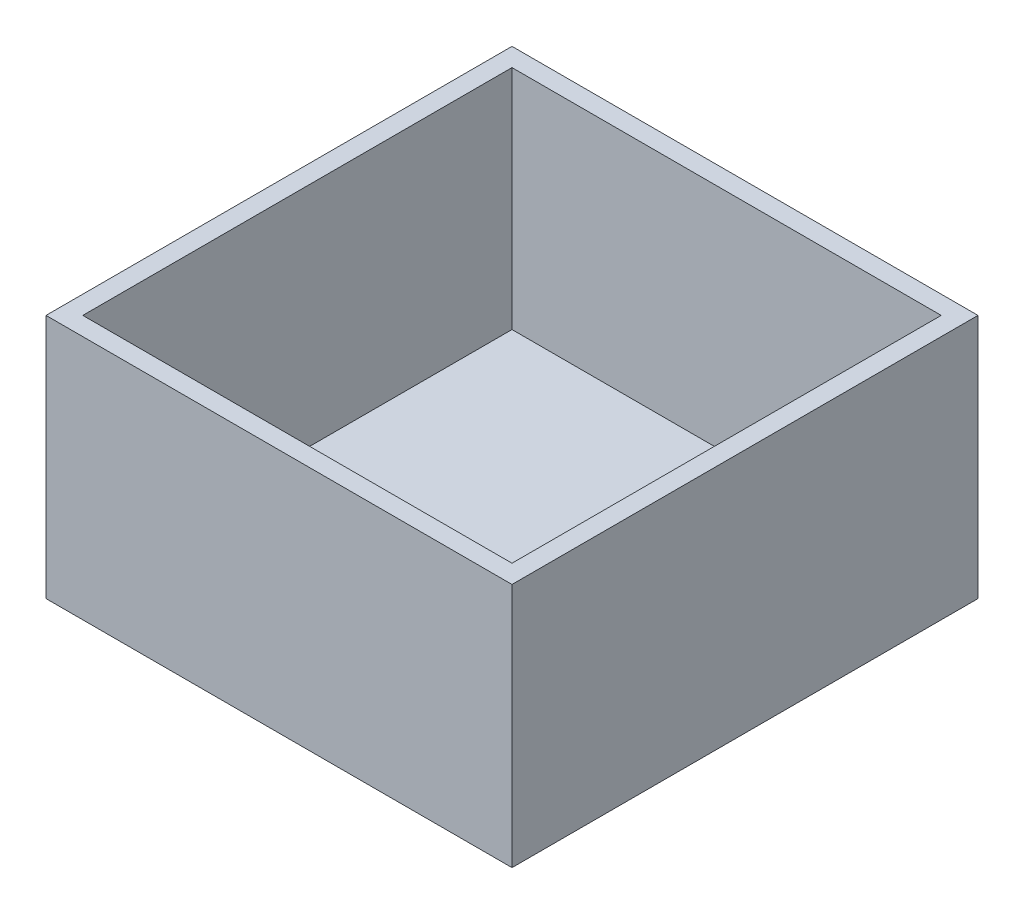
ISO-10303-21;
HEADER;
FILE_DESCRIPTION(('STEP AP214'),'2;1');
FILE_NAME('part.step','',(''),(''),'','','');
FILE_SCHEMA(('AUTOMOTIVE_DESIGN { 1 0 10303 214 1 1 1 1 }'));
ENDSEC;
DATA;
#1=APPLICATION_CONTEXT('core data for automotive mechanical design processes');
#2=APPLICATION_PROTOCOL_DEFINITION('international standard','automotive_design',2000,#1);
#3=PRODUCT_CONTEXT('',#1,'mechanical');
#4=PRODUCT('Part','Part','',(#3));
#5=PRODUCT_RELATED_PRODUCT_CATEGORY('part','',(#4));
#6=PRODUCT_DEFINITION_FORMATION('','',#4);
#7=PRODUCT_DEFINITION_CONTEXT('part definition',#1,'design');
#8=PRODUCT_DEFINITION('design','',#6,#7);
#9=PRODUCT_DEFINITION_SHAPE('','',#8);
#10=(LENGTH_UNIT() NAMED_UNIT(*) SI_UNIT(.MILLI.,.METRE.));
#11=(NAMED_UNIT(*) PLANE_ANGLE_UNIT() SI_UNIT($,.RADIAN.));
#12=(NAMED_UNIT(*) SI_UNIT($,.STERADIAN.) SOLID_ANGLE_UNIT());
#13=UNCERTAINTY_MEASURE_WITH_UNIT(LENGTH_MEASURE(1.E-05),#10,'distance_accuracy_value','');
#14=(GEOMETRIC_REPRESENTATION_CONTEXT(3) GLOBAL_UNCERTAINTY_ASSIGNED_CONTEXT((#13)) GLOBAL_UNIT_ASSIGNED_CONTEXT((#10,
#11,#12)) REPRESENTATION_CONTEXT('',''));
#15=CARTESIAN_POINT('',(0.,0.,0.));
#16=DIRECTION('',(0.,0.,1.));
#17=DIRECTION('',(1.,0.,0.));
#18=AXIS2_PLACEMENT_3D('',#15,#16,#17);
#19=CARTESIAN_POINT('',(0.,40.,0.));
#20=DIRECTION('',(1.,0.,0.));
#21=DIRECTION('',(0.,0.,-1.));
#22=AXIS2_PLACEMENT_3D('',#19,#20,#21);
#23=PLANE('',#22);
#24=DIRECTION('',(0.,-1.,0.));
#25=VECTOR('',#24,1.);
#26=CARTESIAN_POINT('',(0.,40.,0.));
#27=LINE('',#26,#25);
#28=CARTESIAN_POINT('',(0.,40.,0.));
#29=VERTEX_POINT('',#28);
#30=CARTESIAN_POINT('',(0.,3.,0.));
#31=VERTEX_POINT('',#30);
#32=EDGE_CURVE('E114',#29,#31,#27,.T.);
#33=ORIENTED_EDGE('',*,*,#32,.T.);
#34=DIRECTION('',(0.,0.,-1.));
#35=VECTOR('',#34,1.);
#36=CARTESIAN_POINT('',(0.,3.,-70.));
#37=LINE('',#36,#35);
#38=CARTESIAN_POINT('',(0.,3.,-70.));
#39=VERTEX_POINT('',#38);
#40=EDGE_CURVE('E99',#31,#39,#37,.T.);
#41=ORIENTED_EDGE('',*,*,#40,.T.);
#42=DIRECTION('',(0.,-1.,0.));
#43=VECTOR('',#42,1.);
#44=CARTESIAN_POINT('',(0.,40.,-70.));
#45=LINE('',#44,#43);
#46=CARTESIAN_POINT('',(0.,40.,-70.));
#47=VERTEX_POINT('',#46);
#48=EDGE_CURVE('E118',#47,#39,#45,.T.);
#49=ORIENTED_EDGE('',*,*,#48,.F.);
#50=DIRECTION('',(0.,0.,1.));
#51=VECTOR('',#50,1.);
#52=CARTESIAN_POINT('',(0.,40.,0.));
#53=LINE('',#52,#51);
#54=EDGE_CURVE('E269',#47,#29,#53,.T.);
#55=ORIENTED_EDGE('',*,*,#54,.T.);
#56=EDGE_LOOP('',(#33,#41,#49,#55));
#57=FACE_BOUND('',#56,.T.);
#58=ADVANCED_FACE('F33',(#57),#23,.T.);
#59=CARTESIAN_POINT('',(0.,40.,0.));
#60=DIRECTION('',(0.,0.,-1.));
#61=DIRECTION('',(-1.,0.,0.));
#62=AXIS2_PLACEMENT_3D('',#59,#60,#61);
#63=PLANE('',#62);
#64=DIRECTION('',(0.,-1.,0.));
#65=VECTOR('',#64,1.);
#66=CARTESIAN_POINT('',(70.,40.,0.));
#67=LINE('',#66,#65);
#68=CARTESIAN_POINT('',(70.,40.,0.));
#69=VERTEX_POINT('',#68);
#70=CARTESIAN_POINT('',(70.,3.,0.));
#71=VERTEX_POINT('',#70);
#72=EDGE_CURVE('E108',#69,#71,#67,.T.);
#73=ORIENTED_EDGE('',*,*,#72,.T.);
#74=DIRECTION('',(-1.,0.,0.));
#75=VECTOR('',#74,1.);
#76=CARTESIAN_POINT('',(70.,3.,0.));
#77=LINE('',#76,#75);
#78=EDGE_CURVE('E96',#71,#31,#77,.T.);
#79=ORIENTED_EDGE('',*,*,#78,.T.);
#80=ORIENTED_EDGE('',*,*,#32,.F.);
#81=DIRECTION('',(1.,0.,0.));
#82=VECTOR('',#81,1.);
#83=CARTESIAN_POINT('',(0.,40.,0.));
#84=LINE('',#83,#82);
#85=EDGE_CURVE('E113',#29,#69,#84,.T.);
#86=ORIENTED_EDGE('',*,*,#85,.T.);
#87=EDGE_LOOP('',(#73,#79,#80,#86));
#88=FACE_BOUND('',#87,.T.);
#89=ADVANCED_FACE('F111',(#88),#63,.T.);
#90=CARTESIAN_POINT('',(70.,40.,0.));
#91=DIRECTION('',(-1.,0.,0.));
#92=DIRECTION('',(0.,0.,1.));
#93=AXIS2_PLACEMENT_3D('',#90,#91,#92);
#94=PLANE('',#93);
#95=DIRECTION('',(0.,-1.,0.));
#96=VECTOR('',#95,1.);
#97=CARTESIAN_POINT('',(70.,40.,-70.));
#98=LINE('',#97,#96);
#99=CARTESIAN_POINT('',(70.,40.,-70.));
#100=VERTEX_POINT('',#99);
#101=CARTESIAN_POINT('',(70.,3.,-70.));
#102=VERTEX_POINT('',#101);
#103=EDGE_CURVE('E55',#100,#102,#98,.T.);
#104=ORIENTED_EDGE('',*,*,#103,.T.);
#105=DIRECTION('',(0.,0.,1.));
#106=VECTOR('',#105,1.);
#107=CARTESIAN_POINT('',(70.,3.,-70.));
#108=LINE('',#107,#106);
#109=EDGE_CURVE('E48',#102,#71,#108,.T.);
#110=ORIENTED_EDGE('',*,*,#109,.T.);
#111=ORIENTED_EDGE('',*,*,#72,.F.);
#112=DIRECTION('',(0.,0.,-1.));
#113=VECTOR('',#112,1.);
#114=CARTESIAN_POINT('',(70.,40.,0.));
#115=LINE('',#114,#113);
#116=EDGE_CURVE('E264',#69,#100,#115,.T.);
#117=ORIENTED_EDGE('',*,*,#116,.T.);
#118=EDGE_LOOP('',(#104,#110,#111,#117));
#119=FACE_BOUND('',#118,.T.);
#120=ADVANCED_FACE('F107',(#119),#94,.T.);
#121=CARTESIAN_POINT('',(0.,40.,-70.));
#122=DIRECTION('',(0.,0.,1.));
#123=DIRECTION('',(1.,0.,0.));
#124=AXIS2_PLACEMENT_3D('',#121,#122,#123);
#125=PLANE('',#124);
#126=ORIENTED_EDGE('',*,*,#48,.T.);
#127=DIRECTION('',(1.,0.,0.));
#128=VECTOR('',#127,1.);
#129=CARTESIAN_POINT('',(70.,3.,-70.));
#130=LINE('',#129,#128);
#131=EDGE_CURVE('E260',#39,#102,#130,.T.);
#132=ORIENTED_EDGE('',*,*,#131,.T.);
#133=ORIENTED_EDGE('',*,*,#103,.F.);
#134=DIRECTION('',(-1.,0.,0.));
#135=VECTOR('',#134,1.);
#136=CARTESIAN_POINT('',(0.,40.,-70.));
#137=LINE('',#136,#135);
#138=EDGE_CURVE('E262',#100,#47,#137,.T.);
#139=ORIENTED_EDGE('',*,*,#138,.T.);
#140=EDGE_LOOP('',(#126,#132,#133,#139));
#141=FACE_BOUND('',#140,.T.);
#142=ADVANCED_FACE('F184',(#141),#125,.T.);
#143=CARTESIAN_POINT('',(0.,40.,0.));
#144=DIRECTION('',(0.,1.,0.));
#145=DIRECTION('',(0.,0.,1.));
#146=AXIS2_PLACEMENT_3D('',#143,#144,#145);
#147=PLANE('',#146);
#148=DIRECTION('',(1.,0.,0.));
#149=VECTOR('',#148,1.);
#150=CARTESIAN_POINT('',(-3.,40.,3.));
#151=LINE('',#150,#149);
#152=CARTESIAN_POINT('',(-3.,40.,3.));
#153=VERTEX_POINT('',#152);
#154=CARTESIAN_POINT('',(73.,40.,3.));
#155=VERTEX_POINT('',#154);
#156=EDGE_CURVE('E122',#153,#155,#151,.T.);
#157=ORIENTED_EDGE('',*,*,#156,.T.);
#158=DIRECTION('',(0.,0.,-1.));
#159=VECTOR('',#158,1.);
#160=CARTESIAN_POINT('',(73.,40.,3.));
#161=LINE('',#160,#159);
#162=CARTESIAN_POINT('',(73.,40.,-73.));
#163=VERTEX_POINT('',#162);
#164=EDGE_CURVE('E125',#155,#163,#161,.T.);
#165=ORIENTED_EDGE('',*,*,#164,.T.);
#166=DIRECTION('',(-1.,0.,0.));
#167=VECTOR('',#166,1.);
#168=CARTESIAN_POINT('',(-3.,40.,-73.));
#169=LINE('',#168,#167);
#170=CARTESIAN_POINT('',(-3.,40.,-73.));
#171=VERTEX_POINT('',#170);
#172=EDGE_CURVE('E128',#163,#171,#169,.T.);
#173=ORIENTED_EDGE('',*,*,#172,.T.);
#174=DIRECTION('',(0.,0.,1.));
#175=VECTOR('',#174,1.);
#176=CARTESIAN_POINT('',(-3.,40.,3.));
#177=LINE('',#176,#175);
#178=EDGE_CURVE('E130',#171,#153,#177,.T.);
#179=ORIENTED_EDGE('',*,*,#178,.T.);
#180=EDGE_LOOP('',(#157,#165,#173,#179));
#181=FACE_BOUND('',#180,.T.);
#182=ORIENTED_EDGE('',*,*,#85,.F.);
#183=ORIENTED_EDGE('',*,*,#54,.F.);
#184=ORIENTED_EDGE('',*,*,#138,.F.);
#185=ORIENTED_EDGE('',*,*,#116,.F.);
#186=EDGE_LOOP('',(#182,#183,#184,#185));
#187=FACE_BOUND('',#186,.T.);
#188=ADVANCED_FACE('F164',(#181,#187),#147,.T.);
#189=CARTESIAN_POINT('',(0.,0.,0.));
#190=DIRECTION('',(0.,1.,0.));
#191=DIRECTION('',(0.,0.,1.));
#192=AXIS2_PLACEMENT_3D('',#189,#190,#191);
#193=PLANE('',#192);
#194=DIRECTION('',(1.,0.,0.));
#195=VECTOR('',#194,1.);
#196=CARTESIAN_POINT('',(-3.,0.,3.));
#197=LINE('',#196,#195);
#198=CARTESIAN_POINT('',(-3.,0.,3.));
#199=VERTEX_POINT('',#198);
#200=CARTESIAN_POINT('',(73.,0.,3.));
#201=VERTEX_POINT('',#200);
#202=EDGE_CURVE('E116',#199,#201,#197,.T.);
#203=ORIENTED_EDGE('',*,*,#202,.F.);
#204=DIRECTION('',(0.,0.,1.));
#205=VECTOR('',#204,1.);
#206=CARTESIAN_POINT('',(-3.,0.,3.));
#207=LINE('',#206,#205);
#208=CARTESIAN_POINT('',(-3.,0.,-73.));
#209=VERTEX_POINT('',#208);
#210=EDGE_CURVE('E126',#209,#199,#207,.T.);
#211=ORIENTED_EDGE('',*,*,#210,.F.);
#212=DIRECTION('',(-1.,0.,0.));
#213=VECTOR('',#212,1.);
#214=CARTESIAN_POINT('',(-3.,0.,-73.));
#215=LINE('',#214,#213);
#216=CARTESIAN_POINT('',(73.,0.,-73.));
#217=VERTEX_POINT('',#216);
#218=EDGE_CURVE('E137',#217,#209,#215,.T.);
#219=ORIENTED_EDGE('',*,*,#218,.F.);
#220=DIRECTION('',(0.,0.,-1.));
#221=VECTOR('',#220,1.);
#222=CARTESIAN_POINT('',(73.,0.,3.));
#223=LINE('',#222,#221);
#224=EDGE_CURVE('E135',#201,#217,#223,.T.);
#225=ORIENTED_EDGE('',*,*,#224,.F.);
#226=EDGE_LOOP('',(#203,#211,#219,#225));
#227=FACE_BOUND('',#226,.T.);
#228=ADVANCED_FACE('F155',(#227),#193,.F.);
#229=CARTESIAN_POINT('',(-3.,40.,3.));
#230=DIRECTION('',(0.,0.,-1.));
#231=DIRECTION('',(-1.,0.,0.));
#232=AXIS2_PLACEMENT_3D('',#229,#230,#231);
#233=PLANE('',#232);
#234=ORIENTED_EDGE('',*,*,#202,.T.);
#235=DIRECTION('',(0.,-1.,0.));
#236=VECTOR('',#235,1.);
#237=CARTESIAN_POINT('',(73.,40.,3.));
#238=LINE('',#237,#236);
#239=EDGE_CURVE('E11',#155,#201,#238,.T.);
#240=ORIENTED_EDGE('',*,*,#239,.F.);
#241=ORIENTED_EDGE('',*,*,#156,.F.);
#242=DIRECTION('',(0.,-1.,0.));
#243=VECTOR('',#242,1.);
#244=CARTESIAN_POINT('',(-3.,40.,3.));
#245=LINE('',#244,#243);
#246=EDGE_CURVE('E132',#153,#199,#245,.T.);
#247=ORIENTED_EDGE('',*,*,#246,.T.);
#248=EDGE_LOOP('',(#234,#240,#241,#247));
#249=FACE_BOUND('',#248,.T.);
#250=ADVANCED_FACE('F35',(#249),#233,.F.);
#251=CARTESIAN_POINT('',(73.,40.,3.));
#252=DIRECTION('',(-1.,0.,0.));
#253=DIRECTION('',(0.,0.,1.));
#254=AXIS2_PLACEMENT_3D('',#251,#252,#253);
#255=PLANE('',#254);
#256=ORIENTED_EDGE('',*,*,#224,.T.);
#257=DIRECTION('',(0.,-1.,0.));
#258=VECTOR('',#257,1.);
#259=CARTESIAN_POINT('',(73.,40.,-73.));
#260=LINE('',#259,#258);
#261=EDGE_CURVE('E41',#163,#217,#260,.T.);
#262=ORIENTED_EDGE('',*,*,#261,.F.);
#263=ORIENTED_EDGE('',*,*,#164,.F.);
#264=ORIENTED_EDGE('',*,*,#239,.T.);
#265=EDGE_LOOP('',(#256,#262,#263,#264));
#266=FACE_BOUND('',#265,.T.);
#267=ADVANCED_FACE('F166',(#266),#255,.F.);
#268=CARTESIAN_POINT('',(-3.,40.,-73.));
#269=DIRECTION('',(0.,0.,1.));
#270=DIRECTION('',(1.,0.,0.));
#271=AXIS2_PLACEMENT_3D('',#268,#269,#270);
#272=PLANE('',#271);
#273=ORIENTED_EDGE('',*,*,#218,.T.);
#274=DIRECTION('',(0.,-1.,0.));
#275=VECTOR('',#274,1.);
#276=CARTESIAN_POINT('',(-3.,40.,-73.));
#277=LINE('',#276,#275);
#278=EDGE_CURVE('E142',#171,#209,#277,.T.);
#279=ORIENTED_EDGE('',*,*,#278,.F.);
#280=ORIENTED_EDGE('',*,*,#172,.F.);
#281=ORIENTED_EDGE('',*,*,#261,.T.);
#282=EDGE_LOOP('',(#273,#279,#280,#281));
#283=FACE_BOUND('',#282,.T.);
#284=ADVANCED_FACE('F149',(#283),#272,.F.);
#285=CARTESIAN_POINT('',(-3.,40.,3.));
#286=DIRECTION('',(1.,0.,0.));
#287=DIRECTION('',(0.,0.,-1.));
#288=AXIS2_PLACEMENT_3D('',#285,#286,#287);
#289=PLANE('',#288);
#290=ORIENTED_EDGE('',*,*,#210,.T.);
#291=ORIENTED_EDGE('',*,*,#246,.F.);
#292=ORIENTED_EDGE('',*,*,#178,.F.);
#293=ORIENTED_EDGE('',*,*,#278,.T.);
#294=EDGE_LOOP('',(#290,#291,#292,#293));
#295=FACE_BOUND('',#294,.T.);
#296=ADVANCED_FACE('F158',(#295),#289,.F.);
#297=CARTESIAN_POINT('',(0.,3.,0.));
#298=DIRECTION('',(0.,-1.,0.));
#299=DIRECTION('',(0.,0.,-1.));
#300=AXIS2_PLACEMENT_3D('',#297,#298,#299);
#301=PLANE('',#300);
#302=ORIENTED_EDGE('',*,*,#109,.F.);
#303=ORIENTED_EDGE('',*,*,#131,.F.);
#304=ORIENTED_EDGE('',*,*,#40,.F.);
#305=ORIENTED_EDGE('',*,*,#78,.F.);
#306=EDGE_LOOP('',(#302,#303,#304,#305));
#307=FACE_BOUND('',#306,.T.);
#308=ADVANCED_FACE('F97',(#307),#301,.F.);
#309=CLOSED_SHELL('',(#58,#89,#120,#142,#188,#228,#250,#267,#284,#296,#308));
#310=MANIFOLD_SOLID_BREP('B2',#309);
#311=ADVANCED_BREP_SHAPE_REPRESENTATION('',(#18,#310),#14);
#312=SHAPE_DEFINITION_REPRESENTATION(#9,#311);
ENDSEC;
END-ISO-10303-21;
